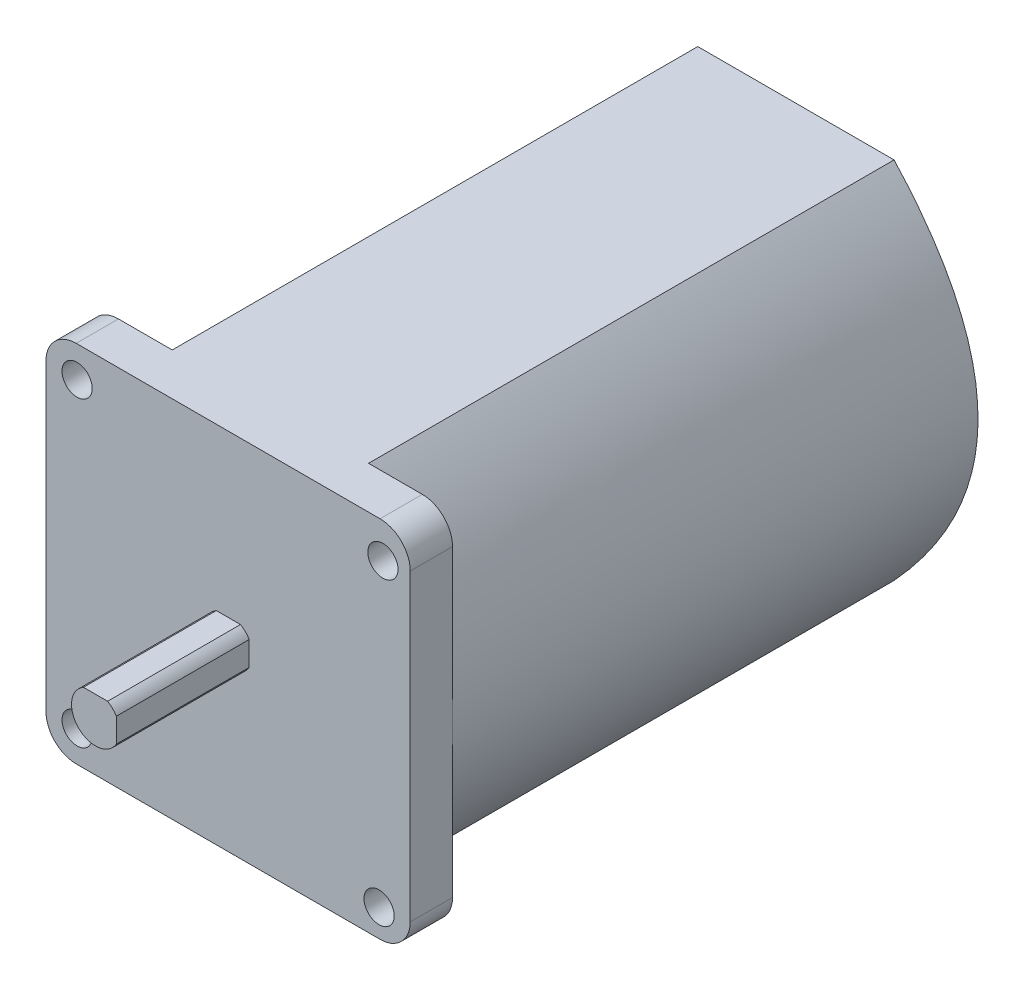
ISO-10303-21;
HEADER;
FILE_DESCRIPTION(('STEP AP214'),'2;1');
FILE_NAME('part.step','',(''),(''),'','','');
FILE_SCHEMA(('AUTOMOTIVE_DESIGN { 1 0 10303 214 1 1 1 1 }'));
ENDSEC;
DATA;
#1=APPLICATION_CONTEXT('core data for automotive mechanical design processes');
#2=APPLICATION_PROTOCOL_DEFINITION('international standard','automotive_design',2000,#1);
#3=PRODUCT_CONTEXT('',#1,'mechanical');
#4=PRODUCT('Part','Part','',(#3));
#5=PRODUCT_RELATED_PRODUCT_CATEGORY('part','',(#4));
#6=PRODUCT_DEFINITION_FORMATION('','',#4);
#7=PRODUCT_DEFINITION_CONTEXT('part definition',#1,'design');
#8=PRODUCT_DEFINITION('design','',#6,#7);
#9=PRODUCT_DEFINITION_SHAPE('','',#8);
#10=(LENGTH_UNIT() NAMED_UNIT(*) SI_UNIT(.MILLI.,.METRE.));
#11=(NAMED_UNIT(*) PLANE_ANGLE_UNIT() SI_UNIT($,.RADIAN.));
#12=(NAMED_UNIT(*) SI_UNIT($,.STERADIAN.) SOLID_ANGLE_UNIT());
#13=UNCERTAINTY_MEASURE_WITH_UNIT(LENGTH_MEASURE(1.E-05),#10,'distance_accuracy_value','');
#14=(GEOMETRIC_REPRESENTATION_CONTEXT(3) GLOBAL_UNCERTAINTY_ASSIGNED_CONTEXT((#13)) GLOBAL_UNIT_ASSIGNED_CONTEXT((#10,
#11,#12)) REPRESENTATION_CONTEXT('',''));
#15=CARTESIAN_POINT('',(0.,0.,0.));
#16=DIRECTION('',(0.,0.,1.));
#17=DIRECTION('',(1.,0.,0.));
#18=AXIS2_PLACEMENT_3D('',#15,#16,#17);
#19=CARTESIAN_POINT('',(-8.9,4.99999999999999,94.));
#20=DIRECTION('',(0.,0.,-1.));
#21=DIRECTION('',(-1.,0.,0.));
#22=AXIS2_PLACEMENT_3D('',#19,#20,#21);
#23=PLANE('',#22);
#24=CARTESIAN_POINT('',(41.8772235132787,54.5148077007955,94.));
#25=DIRECTION('',(0.,0.,1.));
#26=DIRECTION('',(1.,0.,0.));
#27=AXIS2_PLACEMENT_3D('',#24,#25,#26);
#28=CIRCLE('',#27,2.5);
#29=CARTESIAN_POINT('',(44.3772235132787,54.5148077007955,94.));
#30=VERTEX_POINT('',#29);
#31=EDGE_CURVE('E179',#30,#30,#28,.T.);
#32=ORIENTED_EDGE('',*,*,#31,.F.);
#33=EDGE_LOOP('',(#32));
#34=FACE_BOUND('',#33,.T.);
#35=CARTESIAN_POINT('',(-8.74999999999999,5.15,94.));
#36=DIRECTION('',(0.,0.,1.));
#37=DIRECTION('',(1.,0.,0.));
#38=AXIS2_PLACEMENT_3D('',#35,#36,#37);
#39=CIRCLE('',#38,2.5);
#40=CARTESIAN_POINT('',(-6.24999999999999,5.15,94.));
#41=VERTEX_POINT('',#40);
#42=EDGE_CURVE('E194',#41,#41,#39,.T.);
#43=ORIENTED_EDGE('',*,*,#42,.F.);
#44=EDGE_LOOP('',(#43));
#45=FACE_BOUND('',#44,.T.);
#46=CARTESIAN_POINT('',(-8.9,4.99999999999999,94.));
#47=DIRECTION('',(0.,0.,1.));
#48=DIRECTION('',(-1.,0.,0.));
#49=AXIS2_PLACEMENT_3D('',#46,#47,#48);
#50=CIRCLE('',#49,5.);
#51=CARTESIAN_POINT('',(-13.9,5.00000000000003,94.));
#52=VERTEX_POINT('',#51);
#53=CARTESIAN_POINT('',(-8.89999999999996,0.,94.));
#54=VERTEX_POINT('',#53);
#55=EDGE_CURVE('E206',#52,#54,#50,.T.);
#56=ORIENTED_EDGE('',*,*,#55,.T.);
#57=DIRECTION('',(1.,0.,0.));
#58=VECTOR('',#57,1.);
#59=CARTESIAN_POINT('',(41.4,0.,94.));
#60=LINE('',#59,#58);
#61=CARTESIAN_POINT('',(41.4,0.,94.));
#62=VERTEX_POINT('',#61);
#63=EDGE_CURVE('E209',#54,#62,#60,.T.);
#64=ORIENTED_EDGE('',*,*,#63,.T.);
#65=CARTESIAN_POINT('',(41.4,5.,94.));
#66=DIRECTION('',(0.,0.,1.));
#67=DIRECTION('',(-1.,0.,0.));
#68=AXIS2_PLACEMENT_3D('',#65,#66,#67);
#69=CIRCLE('',#68,5.);
#70=CARTESIAN_POINT('',(46.4,5.00000000000004,94.));
#71=VERTEX_POINT('',#70);
#72=EDGE_CURVE('E212',#62,#71,#69,.T.);
#73=ORIENTED_EDGE('',*,*,#72,.T.);
#74=DIRECTION('',(0.,1.,0.));
#75=VECTOR('',#74,1.);
#76=CARTESIAN_POINT('',(46.4,55.2999999999998,94.));
#77=LINE('',#76,#75);
#78=CARTESIAN_POINT('',(46.4,55.2999999999998,94.));
#79=VERTEX_POINT('',#78);
#80=EDGE_CURVE('E214',#71,#79,#77,.T.);
#81=ORIENTED_EDGE('',*,*,#80,.T.);
#82=CARTESIAN_POINT('',(41.4,55.2999999999999,94.));
#83=DIRECTION('',(0.,0.,1.));
#84=DIRECTION('',(-1.,0.,0.));
#85=AXIS2_PLACEMENT_3D('',#82,#83,#84);
#86=CIRCLE('',#85,5.);
#87=CARTESIAN_POINT('',(41.3999999999999,60.2999999999999,94.));
#88=VERTEX_POINT('',#87);
#89=EDGE_CURVE('E216',#79,#88,#86,.T.);
#90=ORIENTED_EDGE('',*,*,#89,.T.);
#91=DIRECTION('',(-1.,0.,0.));
#92=VECTOR('',#91,1.);
#93=CARTESIAN_POINT('',(-8.89999999999997,60.2999999999999,94.));
#94=LINE('',#93,#92);
#95=CARTESIAN_POINT('',(-8.89999999999997,60.2999999999999,94.));
#96=VERTEX_POINT('',#95);
#97=EDGE_CURVE('E218',#88,#96,#94,.T.);
#98=ORIENTED_EDGE('',*,*,#97,.T.);
#99=CARTESIAN_POINT('',(-8.90000000000001,55.2999999999999,94.));
#100=DIRECTION('',(0.,0.,1.));
#101=DIRECTION('',(-1.,0.,0.));
#102=AXIS2_PLACEMENT_3D('',#99,#100,#101);
#103=CIRCLE('',#102,5.);
#104=CARTESIAN_POINT('',(-13.9,55.2999999999998,94.));
#105=VERTEX_POINT('',#104);
#106=EDGE_CURVE('E220',#96,#105,#103,.T.);
#107=ORIENTED_EDGE('',*,*,#106,.T.);
#108=DIRECTION('',(0.,-1.,0.));
#109=VECTOR('',#108,1.);
#110=CARTESIAN_POINT('',(-13.9,55.2999999999998,94.));
#111=LINE('',#110,#109);
#112=EDGE_CURVE('E222',#105,#52,#111,.T.);
#113=ORIENTED_EDGE('',*,*,#112,.T.);
#114=EDGE_LOOP('',(#56,#64,#73,#81,#90,#98,#107,#113));
#115=FACE_BOUND('',#114,.T.);
#116=CARTESIAN_POINT('',(-8.75,55.15,94.));
#117=DIRECTION('',(0.,0.,1.));
#118=DIRECTION('',(1.,0.,0.));
#119=AXIS2_PLACEMENT_3D('',#116,#117,#118);
#120=CIRCLE('',#119,2.5);
#121=CARTESIAN_POINT('',(-6.25,55.15,94.));
#122=VERTEX_POINT('',#121);
#123=EDGE_CURVE('E200',#122,#122,#120,.T.);
#124=ORIENTED_EDGE('',*,*,#123,.F.);
#125=EDGE_LOOP('',(#124));
#126=FACE_BOUND('',#125,.T.);
#127=CARTESIAN_POINT('',(41.2460156070371,4.5187920937584,94.));
#128=DIRECTION('',(0.,0.,1.));
#129=DIRECTION('',(1.,0.,0.));
#130=AXIS2_PLACEMENT_3D('',#127,#128,#129);
#131=CIRCLE('',#130,2.5);
#132=CARTESIAN_POINT('',(43.7460156070371,4.5187920937584,94.));
#133=VERTEX_POINT('',#132);
#134=EDGE_CURVE('E188',#133,#133,#131,.T.);
#135=ORIENTED_EDGE('',*,*,#134,.F.);
#136=EDGE_LOOP('',(#135));
#137=FACE_BOUND('',#136,.T.);
#138=CARTESIAN_POINT('',(16.3001335088736,30.15,94.));
#139=DIRECTION('',(0.,0.,1.));
#140=DIRECTION('',(-1.,0.,0.));
#141=AXIS2_PLACEMENT_3D('',#138,#139,#140);
#142=CIRCLE('',#141,3.9749999999999);
#143=CARTESIAN_POINT('',(19.7353372873996,32.1499999999999,94.));
#144=VERTEX_POINT('',#143);
#145=CARTESIAN_POINT('',(18.3001335088735,33.585203778526,94.));
#146=VERTEX_POINT('',#145);
#147=EDGE_CURVE('E175',#144,#146,#142,.T.);
#148=ORIENTED_EDGE('',*,*,#147,.F.);
#149=DIRECTION('',(0.,1.,0.));
#150=VECTOR('',#149,1.);
#151=CARTESIAN_POINT('',(19.7353372873996,32.1499999999999,94.));
#152=LINE('',#151,#150);
#153=CARTESIAN_POINT('',(19.7353372873996,28.1499999999999,94.));
#154=VERTEX_POINT('',#153);
#155=EDGE_CURVE('E172',#154,#144,#152,.T.);
#156=ORIENTED_EDGE('',*,*,#155,.F.);
#157=CARTESIAN_POINT('',(16.3001335088735,30.1499999999999,94.));
#158=DIRECTION('',(0.,0.,1.));
#159=DIRECTION('',(1.,0.,0.));
#160=AXIS2_PLACEMENT_3D('',#157,#158,#159);
#161=CIRCLE('',#160,3.975);
#162=CARTESIAN_POINT('',(14.3001335088735,33.585203778526,94.));
#163=VERTEX_POINT('',#162);
#164=EDGE_CURVE('E56',#163,#154,#161,.T.);
#165=ORIENTED_EDGE('',*,*,#164,.F.);
#166=DIRECTION('',(-1.,0.,0.));
#167=VECTOR('',#166,1.);
#168=CARTESIAN_POINT('',(18.3001335088735,33.585203778526,94.));
#169=LINE('',#168,#167);
#170=EDGE_CURVE('E51',#146,#163,#169,.T.);
#171=ORIENTED_EDGE('',*,*,#170,.F.);
#172=EDGE_LOOP('',(#148,#156,#165,#171));
#173=FACE_BOUND('',#172,.T.);
#174=ADVANCED_FACE('F33',(#34,#45,#115,#126,#137,#173),#23,.F.);
#175=CARTESIAN_POINT('',(0.,60.3,87.));
#176=CARTESIAN_POINT('',(-27.8,30.15,87.));
#177=CARTESIAN_POINT('',(0.,0.,87.));
#178=B_SPLINE_CURVE_WITH_KNOTS('',2,(#175,#176,#177),.UNSPECIFIED.,.F.,.F.,(3,3),(0.,1.),.UNSPECIFIED.);
#179=DIRECTION('',(0.,0.,-1.));
#180=VECTOR('',#179,1.);
#181=SURFACE_OF_LINEAR_EXTRUSION('',#178,#180);
#182=CARTESIAN_POINT('',(0.,60.3,0.));
#183=CARTESIAN_POINT('',(-27.8,30.15,0.));
#184=CARTESIAN_POINT('',(0.,0.,0.));
#185=B_SPLINE_CURVE_WITH_KNOTS('',2,(#182,#183,#184),.UNSPECIFIED.,.F.,.F.,(3,3),(0.,1.),.UNSPECIFIED.);
#186=CARTESIAN_POINT('',(0.,60.3,0.));
#187=VERTEX_POINT('',#186);
#188=CARTESIAN_POINT('',(0.,0.,0.));
#189=VERTEX_POINT('',#188);
#190=EDGE_CURVE('E274',#187,#189,#185,.T.);
#191=ORIENTED_EDGE('',*,*,#190,.T.);
#192=DIRECTION('',(0.,0.,-1.));
#193=VECTOR('',#192,1.);
#194=CARTESIAN_POINT('',(0.,0.,87.));
#195=LINE('',#194,#193);
#196=CARTESIAN_POINT('',(0.,0.,87.));
#197=VERTEX_POINT('',#196);
#198=EDGE_CURVE('E11',#197,#189,#195,.T.);
#199=ORIENTED_EDGE('',*,*,#198,.F.);
#200=CARTESIAN_POINT('',(-13.9,30.149999999998,87.));
#201=VERTEX_POINT('',#200);
#202=EDGE_CURVE('E303',#201,#197,#178,.T.);
#203=ORIENTED_EDGE('',*,*,#202,.F.);
#204=CARTESIAN_POINT('',(0.,60.3,87.));
#205=VERTEX_POINT('',#204);
#206=EDGE_CURVE('E38',#205,#201,#178,.T.);
#207=ORIENTED_EDGE('',*,*,#206,.F.);
#208=DIRECTION('',(0.,0.,-1.));
#209=VECTOR('',#208,1.);
#210=CARTESIAN_POINT('',(0.,60.3,87.));
#211=LINE('',#210,#209);
#212=EDGE_CURVE('E307',#205,#187,#211,.T.);
#213=ORIENTED_EDGE('',*,*,#212,.T.);
#214=EDGE_LOOP('',(#191,#199,#203,#207,#213));
#215=FACE_BOUND('',#214,.T.);
#216=ADVANCED_FACE('F35',(#215),#181,.F.);
#217=CARTESIAN_POINT('',(0.,0.,87.));
#218=DIRECTION('',(0.,1.,0.));
#219=DIRECTION('',(0.,0.,1.));
#220=AXIS2_PLACEMENT_3D('',#217,#218,#219);
#221=PLANE('',#220);
#222=DIRECTION('',(1.,0.,0.));
#223=VECTOR('',#222,1.);
#224=CARTESIAN_POINT('',(0.,0.,0.));
#225=LINE('',#224,#223);
#226=CARTESIAN_POINT('',(32.5,0.,0.));
#227=VERTEX_POINT('',#226);
#228=EDGE_CURVE('E278',#189,#227,#225,.T.);
#229=ORIENTED_EDGE('',*,*,#228,.T.);
#230=DIRECTION('',(0.,0.,-1.));
#231=VECTOR('',#230,1.);
#232=CARTESIAN_POINT('',(32.5,0.,87.));
#233=LINE('',#232,#231);
#234=CARTESIAN_POINT('',(32.5,0.,87.));
#235=VERTEX_POINT('',#234);
#236=EDGE_CURVE('E43',#235,#227,#233,.T.);
#237=ORIENTED_EDGE('',*,*,#236,.F.);
#238=DIRECTION('',(1.,0.,0.));
#239=VECTOR('',#238,1.);
#240=CARTESIAN_POINT('',(41.4,0.,87.));
#241=LINE('',#240,#239);
#242=CARTESIAN_POINT('',(41.4,0.,87.));
#243=VERTEX_POINT('',#242);
#244=EDGE_CURVE('E227',#235,#243,#241,.T.);
#245=ORIENTED_EDGE('',*,*,#244,.T.);
#246=DIRECTION('',(0.,0.,-1.));
#247=VECTOR('',#246,1.);
#248=CARTESIAN_POINT('',(41.4,0.,94.));
#249=LINE('',#248,#247);
#250=EDGE_CURVE('E270',#62,#243,#249,.T.);
#251=ORIENTED_EDGE('',*,*,#250,.F.);
#252=ORIENTED_EDGE('',*,*,#63,.F.);
#253=DIRECTION('',(0.,0.,-1.));
#254=VECTOR('',#253,1.);
#255=CARTESIAN_POINT('',(-8.89999999999996,0.,94.));
#256=LINE('',#255,#254);
#257=CARTESIAN_POINT('',(-8.89999999999996,0.,87.));
#258=VERTEX_POINT('',#257);
#259=EDGE_CURVE('E272',#54,#258,#256,.T.);
#260=ORIENTED_EDGE('',*,*,#259,.T.);
#261=EDGE_CURVE('E235',#258,#197,#241,.T.);
#262=ORIENTED_EDGE('',*,*,#261,.T.);
#263=ORIENTED_EDGE('',*,*,#198,.T.);
#264=EDGE_LOOP('',(#229,#237,#245,#251,#252,#260,#262,#263));
#265=FACE_BOUND('',#264,.T.);
#266=ADVANCED_FACE('F341',(#265),#221,.F.);
#267=CARTESIAN_POINT('',(32.5,0.,87.));
#268=CARTESIAN_POINT('',(60.3,30.15,87.));
#269=CARTESIAN_POINT('',(32.5,60.3,87.));
#270=B_SPLINE_CURVE_WITH_KNOTS('',2,(#267,#268,#269),.UNSPECIFIED.,.F.,.F.,(3,3),(0.,1.),.UNSPECIFIED.);
#271=DIRECTION('',(0.,0.,-1.));
#272=VECTOR('',#271,1.);
#273=SURFACE_OF_LINEAR_EXTRUSION('',#270,#272);
#274=CARTESIAN_POINT('',(32.5,0.,0.));
#275=CARTESIAN_POINT('',(60.3,30.15,0.));
#276=CARTESIAN_POINT('',(32.5,60.3,0.));
#277=B_SPLINE_CURVE_WITH_KNOTS('',2,(#274,#275,#276),.UNSPECIFIED.,.F.,.F.,(3,3),(0.,1.),.UNSPECIFIED.);
#278=CARTESIAN_POINT('',(32.5,60.3,0.));
#279=VERTEX_POINT('',#278);
#280=EDGE_CURVE('E283',#227,#279,#277,.T.);
#281=ORIENTED_EDGE('',*,*,#280,.T.);
#282=DIRECTION('',(0.,0.,-1.));
#283=VECTOR('',#282,1.);
#284=CARTESIAN_POINT('',(32.5,60.3,87.));
#285=LINE('',#284,#283);
#286=CARTESIAN_POINT('',(32.5,60.2999999999999,87.));
#287=VERTEX_POINT('',#286);
#288=EDGE_CURVE('E304',#287,#279,#285,.T.);
#289=ORIENTED_EDGE('',*,*,#288,.F.);
#290=CARTESIAN_POINT('',(46.4,30.1500000000092,87.));
#291=VERTEX_POINT('',#290);
#292=EDGE_CURVE('E310',#291,#287,#270,.T.);
#293=ORIENTED_EDGE('',*,*,#292,.F.);
#294=EDGE_CURVE('E313',#235,#291,#270,.T.);
#295=ORIENTED_EDGE('',*,*,#294,.F.);
#296=ORIENTED_EDGE('',*,*,#236,.T.);
#297=EDGE_LOOP('',(#281,#289,#293,#295,#296));
#298=FACE_BOUND('',#297,.T.);
#299=ADVANCED_FACE('F377',(#298),#273,.F.);
#300=CARTESIAN_POINT('',(0.,60.3,87.));
#301=DIRECTION('',(0.,-1.,0.));
#302=DIRECTION('',(0.,0.,-1.));
#303=AXIS2_PLACEMENT_3D('',#300,#301,#302);
#304=PLANE('',#303);
#305=DIRECTION('',(-1.,0.,0.));
#306=VECTOR('',#305,1.);
#307=CARTESIAN_POINT('',(0.,60.3,0.));
#308=LINE('',#307,#306);
#309=EDGE_CURVE('E298',#279,#187,#308,.T.);
#310=ORIENTED_EDGE('',*,*,#309,.T.);
#311=ORIENTED_EDGE('',*,*,#212,.F.);
#312=DIRECTION('',(-1.,0.,0.));
#313=VECTOR('',#312,1.);
#314=CARTESIAN_POINT('',(-8.89999999999997,60.2999999999999,87.));
#315=LINE('',#314,#313);
#316=CARTESIAN_POINT('',(-8.89999999999997,60.2999999999999,87.));
#317=VERTEX_POINT('',#316);
#318=EDGE_CURVE('E238',#205,#317,#315,.T.);
#319=ORIENTED_EDGE('',*,*,#318,.T.);
#320=DIRECTION('',(0.,0.,-1.));
#321=VECTOR('',#320,1.);
#322=CARTESIAN_POINT('',(-8.89999999999997,60.2999999999999,94.));
#323=LINE('',#322,#321);
#324=EDGE_CURVE('E258',#96,#317,#323,.T.);
#325=ORIENTED_EDGE('',*,*,#324,.F.);
#326=ORIENTED_EDGE('',*,*,#97,.F.);
#327=DIRECTION('',(0.,0.,-1.));
#328=VECTOR('',#327,1.);
#329=CARTESIAN_POINT('',(41.3999999999999,60.2999999999999,94.));
#330=LINE('',#329,#328);
#331=CARTESIAN_POINT('',(41.3999999999999,60.2999999999999,87.));
#332=VERTEX_POINT('',#331);
#333=EDGE_CURVE('E261',#88,#332,#330,.T.);
#334=ORIENTED_EDGE('',*,*,#333,.T.);
#335=EDGE_CURVE('E241',#332,#287,#315,.T.);
#336=ORIENTED_EDGE('',*,*,#335,.T.);
#337=ORIENTED_EDGE('',*,*,#288,.T.);
#338=EDGE_LOOP('',(#310,#311,#319,#325,#326,#334,#336,#337));
#339=FACE_BOUND('',#338,.T.);
#340=ADVANCED_FACE('F356',(#339),#304,.F.);
#341=CARTESIAN_POINT('',(-13.9,30.15,0.));
#342=DIRECTION('',(0.,0.,-1.));
#343=DIRECTION('',(-1.,0.,0.));
#344=AXIS2_PLACEMENT_3D('',#341,#342,#343);
#345=PLANE('',#344);
#346=ORIENTED_EDGE('',*,*,#190,.F.);
#347=ORIENTED_EDGE('',*,*,#309,.F.);
#348=ORIENTED_EDGE('',*,*,#280,.F.);
#349=ORIENTED_EDGE('',*,*,#228,.F.);
#350=EDGE_LOOP('',(#346,#347,#348,#349));
#351=FACE_BOUND('',#350,.T.);
#352=ADVANCED_FACE('F339',(#351),#345,.T.);
#353=CARTESIAN_POINT('',(-8.9,4.99999999999999,87.));
#354=DIRECTION('',(0.,0.,-1.));
#355=DIRECTION('',(-1.,0.,0.));
#356=AXIS2_PLACEMENT_3D('',#353,#354,#355);
#357=PLANE('',#356);
#358=CARTESIAN_POINT('',(-8.75,55.15,87.));
#359=DIRECTION('',(0.,0.,1.));
#360=DIRECTION('',(1.,0.,0.));
#361=AXIS2_PLACEMENT_3D('',#358,#359,#360);
#362=CIRCLE('',#361,2.5);
#363=CARTESIAN_POINT('',(-6.25,55.15,87.));
#364=VERTEX_POINT('',#363);
#365=EDGE_CURVE('E197',#364,#364,#362,.T.);
#366=ORIENTED_EDGE('',*,*,#365,.T.);
#367=EDGE_LOOP('',(#366));
#368=FACE_BOUND('',#367,.T.);
#369=ORIENTED_EDGE('',*,*,#318,.F.);
#370=ORIENTED_EDGE('',*,*,#206,.T.);
#371=DIRECTION('',(0.,-1.,0.));
#372=VECTOR('',#371,1.);
#373=CARTESIAN_POINT('',(-13.9,55.2999999999998,87.));
#374=LINE('',#373,#372);
#375=CARTESIAN_POINT('',(-13.9,55.2999999999998,87.));
#376=VERTEX_POINT('',#375);
#377=EDGE_CURVE('E210',#376,#201,#374,.T.);
#378=ORIENTED_EDGE('',*,*,#377,.F.);
#379=CARTESIAN_POINT('',(-8.90000000000001,55.2999999999999,87.));
#380=DIRECTION('',(0.,0.,1.));
#381=DIRECTION('',(-1.,0.,0.));
#382=AXIS2_PLACEMENT_3D('',#379,#380,#381);
#383=CIRCLE('',#382,5.);
#384=EDGE_CURVE('E247',#317,#376,#383,.T.);
#385=ORIENTED_EDGE('',*,*,#384,.F.);
#386=EDGE_LOOP('',(#369,#370,#378,#385));
#387=FACE_BOUND('',#386,.T.);
#388=ADVANCED_FACE('F354',(#368,#387),#357,.T.);
#389=CARTESIAN_POINT('',(-8.74999999999999,5.15,87.));
#390=DIRECTION('',(0.,0.,1.));
#391=DIRECTION('',(1.,0.,0.));
#392=AXIS2_PLACEMENT_3D('',#389,#390,#391);
#393=CIRCLE('',#392,2.5);
#394=CARTESIAN_POINT('',(-6.24999999999999,5.15,87.));
#395=VERTEX_POINT('',#394);
#396=EDGE_CURVE('E191',#395,#395,#393,.T.);
#397=ORIENTED_EDGE('',*,*,#396,.T.);
#398=EDGE_LOOP('',(#397));
#399=FACE_BOUND('',#398,.T.);
#400=CARTESIAN_POINT('',(-13.9,5.00000000000003,87.));
#401=VERTEX_POINT('',#400);
#402=EDGE_CURVE('E250',#201,#401,#374,.T.);
#403=ORIENTED_EDGE('',*,*,#402,.F.);
#404=ORIENTED_EDGE('',*,*,#202,.T.);
#405=ORIENTED_EDGE('',*,*,#261,.F.);
#406=CARTESIAN_POINT('',(-8.9,4.99999999999999,87.));
#407=DIRECTION('',(0.,0.,1.));
#408=DIRECTION('',(-1.,0.,0.));
#409=AXIS2_PLACEMENT_3D('',#406,#407,#408);
#410=CIRCLE('',#409,5.);
#411=EDGE_CURVE('E203',#401,#258,#410,.T.);
#412=ORIENTED_EDGE('',*,*,#411,.F.);
#413=EDGE_LOOP('',(#403,#404,#405,#412));
#414=FACE_BOUND('',#413,.T.);
#415=ADVANCED_FACE('F344',(#399,#414),#357,.T.);
#416=CARTESIAN_POINT('',(41.2460156070371,4.5187920937584,87.));
#417=DIRECTION('',(0.,0.,1.));
#418=DIRECTION('',(1.,0.,0.));
#419=AXIS2_PLACEMENT_3D('',#416,#417,#418);
#420=CIRCLE('',#419,2.5);
#421=CARTESIAN_POINT('',(43.7460156070371,4.5187920937584,87.));
#422=VERTEX_POINT('',#421);
#423=EDGE_CURVE('E186',#422,#422,#420,.T.);
#424=ORIENTED_EDGE('',*,*,#423,.T.);
#425=EDGE_LOOP('',(#424));
#426=FACE_BOUND('',#425,.T.);
#427=ORIENTED_EDGE('',*,*,#244,.F.);
#428=ORIENTED_EDGE('',*,*,#294,.T.);
#429=DIRECTION('',(0.,1.,0.));
#430=VECTOR('',#429,1.);
#431=CARTESIAN_POINT('',(46.4,55.2999999999998,87.));
#432=LINE('',#431,#430);
#433=CARTESIAN_POINT('',(46.4,5.00000000000004,87.));
#434=VERTEX_POINT('',#433);
#435=EDGE_CURVE('E383',#434,#291,#432,.T.);
#436=ORIENTED_EDGE('',*,*,#435,.F.);
#437=CARTESIAN_POINT('',(41.4,5.,87.));
#438=DIRECTION('',(0.,0.,1.));
#439=DIRECTION('',(-1.,0.,0.));
#440=AXIS2_PLACEMENT_3D('',#437,#438,#439);
#441=CIRCLE('',#440,5.);
#442=EDGE_CURVE('E230',#243,#434,#441,.T.);
#443=ORIENTED_EDGE('',*,*,#442,.F.);
#444=EDGE_LOOP('',(#427,#428,#436,#443));
#445=FACE_BOUND('',#444,.T.);
#446=ADVANCED_FACE('F381',(#426,#445),#357,.T.);
#447=CARTESIAN_POINT('',(46.4,55.2999999999998,87.));
#448=VERTEX_POINT('',#447);
#449=EDGE_CURVE('E373',#291,#448,#432,.T.);
#450=ORIENTED_EDGE('',*,*,#449,.F.);
#451=ORIENTED_EDGE('',*,*,#292,.T.);
#452=ORIENTED_EDGE('',*,*,#335,.F.);
#453=CARTESIAN_POINT('',(41.4,55.2999999999999,87.));
#454=DIRECTION('',(0.,0.,1.));
#455=DIRECTION('',(-1.,0.,0.));
#456=AXIS2_PLACEMENT_3D('',#453,#454,#455);
#457=CIRCLE('',#456,5.);
#458=EDGE_CURVE('E242',#448,#332,#457,.T.);
#459=ORIENTED_EDGE('',*,*,#458,.F.);
#460=EDGE_LOOP('',(#450,#451,#452,#459));
#461=FACE_BOUND('',#460,.T.);
#462=CARTESIAN_POINT('',(41.8772235132787,54.5148077007955,87.));
#463=DIRECTION('',(0.,0.,1.));
#464=DIRECTION('',(1.,0.,0.));
#465=AXIS2_PLACEMENT_3D('',#462,#463,#464);
#466=CIRCLE('',#465,2.5);
#467=CARTESIAN_POINT('',(44.3772235132787,54.5148077007955,87.));
#468=VERTEX_POINT('',#467);
#469=EDGE_CURVE('E176',#468,#468,#466,.T.);
#470=ORIENTED_EDGE('',*,*,#469,.T.);
#471=EDGE_LOOP('',(#470));
#472=FACE_BOUND('',#471,.T.);
#473=ADVANCED_FACE('F371',(#461,#472),#357,.T.);
#474=CARTESIAN_POINT('',(-8.9,4.99999999999999,94.));
#475=DIRECTION('',(0.,0.,-1.));
#476=DIRECTION('',(-1.,0.,0.));
#477=AXIS2_PLACEMENT_3D('',#474,#475,#476);
#478=CYLINDRICAL_SURFACE('',#477,5.);
#479=ORIENTED_EDGE('',*,*,#411,.T.);
#480=ORIENTED_EDGE('',*,*,#259,.F.);
#481=ORIENTED_EDGE('',*,*,#55,.F.);
#482=DIRECTION('',(0.,0.,-1.));
#483=VECTOR('',#482,1.);
#484=CARTESIAN_POINT('',(-13.9,5.00000000000003,94.));
#485=LINE('',#484,#483);
#486=EDGE_CURVE('E224',#52,#401,#485,.T.);
#487=ORIENTED_EDGE('',*,*,#486,.T.);
#488=EDGE_LOOP('',(#479,#480,#481,#487));
#489=FACE_BOUND('',#488,.T.);
#490=ADVANCED_FACE('F393',(#489),#478,.T.);
#491=CARTESIAN_POINT('',(41.4,5.,94.));
#492=DIRECTION('',(0.,0.,-1.));
#493=DIRECTION('',(-1.,0.,0.));
#494=AXIS2_PLACEMENT_3D('',#491,#492,#493);
#495=CYLINDRICAL_SURFACE('',#494,5.);
#496=ORIENTED_EDGE('',*,*,#442,.T.);
#497=DIRECTION('',(0.,0.,-1.));
#498=VECTOR('',#497,1.);
#499=CARTESIAN_POINT('',(46.4,5.00000000000004,94.));
#500=LINE('',#499,#498);
#501=EDGE_CURVE('E267',#71,#434,#500,.T.);
#502=ORIENTED_EDGE('',*,*,#501,.F.);
#503=ORIENTED_EDGE('',*,*,#72,.F.);
#504=ORIENTED_EDGE('',*,*,#250,.T.);
#505=EDGE_LOOP('',(#496,#502,#503,#504));
#506=FACE_BOUND('',#505,.T.);
#507=ADVANCED_FACE('F387',(#506),#495,.T.);
#508=CARTESIAN_POINT('',(46.4,55.2999999999998,94.));
#509=DIRECTION('',(-1.,0.,0.));
#510=DIRECTION('',(0.,-1.,0.));
#511=AXIS2_PLACEMENT_3D('',#508,#509,#510);
#512=PLANE('',#511);
#513=ORIENTED_EDGE('',*,*,#435,.T.);
#514=ORIENTED_EDGE('',*,*,#449,.T.);
#515=DIRECTION('',(0.,0.,-1.));
#516=VECTOR('',#515,1.);
#517=CARTESIAN_POINT('',(46.4,55.2999999999998,94.));
#518=LINE('',#517,#516);
#519=EDGE_CURVE('E264',#79,#448,#518,.T.);
#520=ORIENTED_EDGE('',*,*,#519,.F.);
#521=ORIENTED_EDGE('',*,*,#80,.F.);
#522=ORIENTED_EDGE('',*,*,#501,.T.);
#523=EDGE_LOOP('',(#513,#514,#520,#521,#522));
#524=FACE_BOUND('',#523,.T.);
#525=ADVANCED_FACE('F400',(#524),#512,.F.);
#526=CARTESIAN_POINT('',(41.4,55.2999999999999,94.));
#527=DIRECTION('',(0.,0.,-1.));
#528=DIRECTION('',(-1.,0.,0.));
#529=AXIS2_PLACEMENT_3D('',#526,#527,#528);
#530=CYLINDRICAL_SURFACE('',#529,5.);
#531=ORIENTED_EDGE('',*,*,#458,.T.);
#532=ORIENTED_EDGE('',*,*,#333,.F.);
#533=ORIENTED_EDGE('',*,*,#89,.F.);
#534=ORIENTED_EDGE('',*,*,#519,.T.);
#535=EDGE_LOOP('',(#531,#532,#533,#534));
#536=FACE_BOUND('',#535,.T.);
#537=ADVANCED_FACE('F420',(#536),#530,.T.);
#538=CARTESIAN_POINT('',(-8.90000000000001,55.2999999999999,94.));
#539=DIRECTION('',(0.,0.,-1.));
#540=DIRECTION('',(-1.,0.,0.));
#541=AXIS2_PLACEMENT_3D('',#538,#539,#540);
#542=CYLINDRICAL_SURFACE('',#541,5.);
#543=ORIENTED_EDGE('',*,*,#384,.T.);
#544=DIRECTION('',(0.,0.,-1.));
#545=VECTOR('',#544,1.);
#546=CARTESIAN_POINT('',(-13.9,55.2999999999998,94.));
#547=LINE('',#546,#545);
#548=EDGE_CURVE('E255',#105,#376,#547,.T.);
#549=ORIENTED_EDGE('',*,*,#548,.F.);
#550=ORIENTED_EDGE('',*,*,#106,.F.);
#551=ORIENTED_EDGE('',*,*,#324,.T.);
#552=EDGE_LOOP('',(#543,#549,#550,#551));
#553=FACE_BOUND('',#552,.T.);
#554=ADVANCED_FACE('F360',(#553),#542,.T.);
#555=CARTESIAN_POINT('',(-13.9,55.2999999999998,94.));
#556=DIRECTION('',(1.,0.,0.));
#557=DIRECTION('',(0.,1.,0.));
#558=AXIS2_PLACEMENT_3D('',#555,#556,#557);
#559=PLANE('',#558);
#560=ORIENTED_EDGE('',*,*,#377,.T.);
#561=ORIENTED_EDGE('',*,*,#402,.T.);
#562=ORIENTED_EDGE('',*,*,#486,.F.);
#563=ORIENTED_EDGE('',*,*,#112,.F.);
#564=ORIENTED_EDGE('',*,*,#548,.T.);
#565=EDGE_LOOP('',(#560,#561,#562,#563,#564));
#566=FACE_BOUND('',#565,.T.);
#567=ADVANCED_FACE('F349',(#566),#559,.F.);
#568=CARTESIAN_POINT('',(-8.75,55.15,94.));
#569=DIRECTION('',(0.,0.,-1.));
#570=DIRECTION('',(-1.,0.,0.));
#571=AXIS2_PLACEMENT_3D('',#568,#569,#570);
#572=CYLINDRICAL_SURFACE('',#571,2.5);
#573=ORIENTED_EDGE('',*,*,#123,.T.);
#574=EDGE_LOOP('',(#573));
#575=FACE_BOUND('',#574,.T.);
#576=ORIENTED_EDGE('',*,*,#365,.F.);
#577=EDGE_LOOP('',(#576));
#578=FACE_BOUND('',#577,.T.);
#579=ADVANCED_FACE('F413',(#575,#578),#572,.F.);
#580=CARTESIAN_POINT('',(-8.74999999999999,5.15,94.));
#581=DIRECTION('',(0.,0.,-1.));
#582=DIRECTION('',(-1.,0.,0.));
#583=AXIS2_PLACEMENT_3D('',#580,#581,#582);
#584=CYLINDRICAL_SURFACE('',#583,2.5);
#585=ORIENTED_EDGE('',*,*,#42,.T.);
#586=EDGE_LOOP('',(#585));
#587=FACE_BOUND('',#586,.T.);
#588=ORIENTED_EDGE('',*,*,#396,.F.);
#589=EDGE_LOOP('',(#588));
#590=FACE_BOUND('',#589,.T.);
#591=ADVANCED_FACE('F447',(#587,#590),#584,.F.);
#592=CARTESIAN_POINT('',(41.2460156070371,4.5187920937584,94.));
#593=DIRECTION('',(0.,0.,-1.));
#594=DIRECTION('',(-1.,0.,0.));
#595=AXIS2_PLACEMENT_3D('',#592,#593,#594);
#596=CYLINDRICAL_SURFACE('',#595,2.5);
#597=ORIENTED_EDGE('',*,*,#134,.T.);
#598=EDGE_LOOP('',(#597));
#599=FACE_BOUND('',#598,.T.);
#600=ORIENTED_EDGE('',*,*,#423,.F.);
#601=EDGE_LOOP('',(#600));
#602=FACE_BOUND('',#601,.T.);
#603=ADVANCED_FACE('F454',(#599,#602),#596,.F.);
#604=CARTESIAN_POINT('',(41.8772235132787,54.5148077007955,94.));
#605=DIRECTION('',(0.,0.,-1.));
#606=DIRECTION('',(-1.,0.,0.));
#607=AXIS2_PLACEMENT_3D('',#604,#605,#606);
#608=CYLINDRICAL_SURFACE('',#607,2.5);
#609=ORIENTED_EDGE('',*,*,#31,.T.);
#610=EDGE_LOOP('',(#609));
#611=FACE_BOUND('',#610,.T.);
#612=ORIENTED_EDGE('',*,*,#469,.F.);
#613=EDGE_LOOP('',(#612));
#614=FACE_BOUND('',#613,.T.);
#615=ADVANCED_FACE('F461',(#611,#614),#608,.F.);
#616=CARTESIAN_POINT('',(16.3001335088736,30.15,116.));
#617=DIRECTION('',(0.,0.,-1.));
#618=DIRECTION('',(-1.,0.,0.));
#619=AXIS2_PLACEMENT_3D('',#616,#617,#618);
#620=CYLINDRICAL_SURFACE('',#619,3.9749999999999);
#621=ORIENTED_EDGE('',*,*,#147,.T.);
#622=DIRECTION('',(0.,0.,-1.));
#623=VECTOR('',#622,1.);
#624=CARTESIAN_POINT('',(18.3001335088735,33.585203778526,116.));
#625=LINE('',#624,#623);
#626=CARTESIAN_POINT('',(18.3001335088735,33.585203778526,116.));
#627=VERTEX_POINT('',#626);
#628=EDGE_CURVE('E156',#627,#146,#625,.T.);
#629=ORIENTED_EDGE('',*,*,#628,.F.);
#630=CARTESIAN_POINT('',(16.3001335088736,30.15,116.));
#631=DIRECTION('',(0.,0.,1.));
#632=DIRECTION('',(-1.,0.,0.));
#633=AXIS2_PLACEMENT_3D('',#630,#631,#632);
#634=CIRCLE('',#633,3.9749999999999);
#635=CARTESIAN_POINT('',(19.7353372873996,32.1499999999999,116.));
#636=VERTEX_POINT('',#635);
#637=EDGE_CURVE('E163',#636,#627,#634,.T.);
#638=ORIENTED_EDGE('',*,*,#637,.F.);
#639=DIRECTION('',(0.,0.,-1.));
#640=VECTOR('',#639,1.);
#641=CARTESIAN_POINT('',(19.7353372873996,32.1499999999999,116.));
#642=LINE('',#641,#640);
#643=EDGE_CURVE('E624',#636,#144,#642,.T.);
#644=ORIENTED_EDGE('',*,*,#643,.T.);
#645=EDGE_LOOP('',(#621,#629,#638,#644));
#646=FACE_BOUND('',#645,.T.);
#647=ADVANCED_FACE('F174',(#646),#620,.T.);
#648=CARTESIAN_POINT('',(18.3001335088735,33.585203778526,116.));
#649=DIRECTION('',(0.,-1.,0.));
#650=DIRECTION('',(0.,0.,-1.));
#651=AXIS2_PLACEMENT_3D('',#648,#649,#650);
#652=PLANE('',#651);
#653=ORIENTED_EDGE('',*,*,#170,.T.);
#654=DIRECTION('',(0.,0.,-1.));
#655=VECTOR('',#654,1.);
#656=CARTESIAN_POINT('',(14.3001335088735,33.585203778526,116.));
#657=LINE('',#656,#655);
#658=CARTESIAN_POINT('',(14.3001335088735,33.585203778526,116.));
#659=VERTEX_POINT('',#658);
#660=EDGE_CURVE('E159',#659,#163,#657,.T.);
#661=ORIENTED_EDGE('',*,*,#660,.F.);
#662=DIRECTION('',(-1.,0.,0.));
#663=VECTOR('',#662,1.);
#664=CARTESIAN_POINT('',(18.3001335088735,33.585203778526,116.));
#665=LINE('',#664,#663);
#666=EDGE_CURVE('E152',#627,#659,#665,.T.);
#667=ORIENTED_EDGE('',*,*,#666,.F.);
#668=ORIENTED_EDGE('',*,*,#628,.T.);
#669=EDGE_LOOP('',(#653,#661,#667,#668));
#670=FACE_BOUND('',#669,.T.);
#671=ADVANCED_FACE('F154',(#670),#652,.F.);
#672=CARTESIAN_POINT('',(16.3001335088735,30.1499999999999,116.));
#673=DIRECTION('',(0.,0.,-1.));
#674=DIRECTION('',(-1.,0.,0.));
#675=AXIS2_PLACEMENT_3D('',#672,#673,#674);
#676=CYLINDRICAL_SURFACE('',#675,3.975);
#677=ORIENTED_EDGE('',*,*,#164,.T.);
#678=DIRECTION('',(0.,0.,-1.));
#679=VECTOR('',#678,1.);
#680=CARTESIAN_POINT('',(19.7353372873996,28.1499999999999,116.));
#681=LINE('',#680,#679);
#682=CARTESIAN_POINT('',(19.7353372873996,28.1499999999999,116.));
#683=VERTEX_POINT('',#682);
#684=EDGE_CURVE('E181',#683,#154,#681,.T.);
#685=ORIENTED_EDGE('',*,*,#684,.F.);
#686=CARTESIAN_POINT('',(16.3001335088735,30.1499999999999,116.));
#687=DIRECTION('',(0.,0.,1.));
#688=DIRECTION('',(1.,0.,0.));
#689=AXIS2_PLACEMENT_3D('',#686,#687,#688);
#690=CIRCLE('',#689,3.975);
#691=EDGE_CURVE('E162',#659,#683,#690,.T.);
#692=ORIENTED_EDGE('',*,*,#691,.F.);
#693=ORIENTED_EDGE('',*,*,#660,.T.);
#694=EDGE_LOOP('',(#677,#685,#692,#693));
#695=FACE_BOUND('',#694,.T.);
#696=ADVANCED_FACE('F482',(#695),#676,.T.);
#697=CARTESIAN_POINT('',(19.7353372873996,32.1499999999999,116.));
#698=DIRECTION('',(-1.,0.,0.));
#699=DIRECTION('',(0.,-1.,0.));
#700=AXIS2_PLACEMENT_3D('',#697,#698,#699);
#701=PLANE('',#700);
#702=ORIENTED_EDGE('',*,*,#155,.T.);
#703=ORIENTED_EDGE('',*,*,#643,.F.);
#704=DIRECTION('',(0.,1.,0.));
#705=VECTOR('',#704,1.);
#706=CARTESIAN_POINT('',(19.7353372873996,32.1499999999999,116.));
#707=LINE('',#706,#705);
#708=EDGE_CURVE('E168',#683,#636,#707,.T.);
#709=ORIENTED_EDGE('',*,*,#708,.F.);
#710=ORIENTED_EDGE('',*,*,#684,.T.);
#711=EDGE_LOOP('',(#702,#703,#709,#710));
#712=FACE_BOUND('',#711,.T.);
#713=ADVANCED_FACE('F489',(#712),#701,.F.);
#714=CARTESIAN_POINT('',(16.3001335088736,30.15,116.));
#715=DIRECTION('',(0.,0.,-1.));
#716=DIRECTION('',(-1.,0.,0.));
#717=AXIS2_PLACEMENT_3D('',#714,#715,#716);
#718=PLANE('',#717);
#719=ORIENTED_EDGE('',*,*,#637,.T.);
#720=ORIENTED_EDGE('',*,*,#666,.T.);
#721=ORIENTED_EDGE('',*,*,#691,.T.);
#722=ORIENTED_EDGE('',*,*,#708,.T.);
#723=EDGE_LOOP('',(#719,#720,#721,#722));
#724=FACE_BOUND('',#723,.T.);
#725=ADVANCED_FACE('F166',(#724),#718,.F.);
#726=CLOSED_SHELL('',(#174,#216,#266,#299,#340,#352,#388,#415,#446,#473,#490,#507,#525,#537,
#554,#567,#579,#591,#603,#615,#647,#671,#696,#713,#725));
#727=MANIFOLD_SOLID_BREP('B2',#726);
#728=ADVANCED_BREP_SHAPE_REPRESENTATION('',(#18,#727),#14);
#729=SHAPE_DEFINITION_REPRESENTATION(#9,#728);
ENDSEC;
END-ISO-10303-21;
